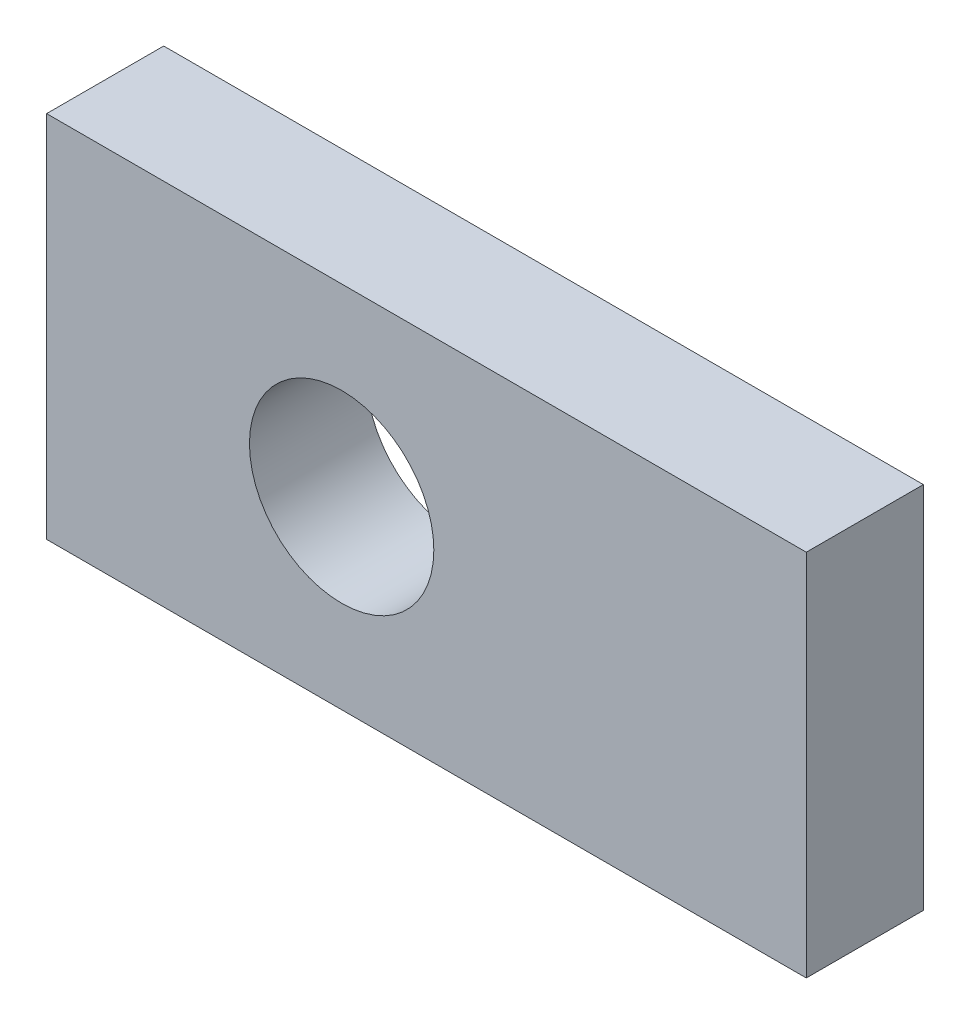
ISO-10303-21;
HEADER;
FILE_DESCRIPTION(('STEP AP214'),'2;1');
FILE_NAME('part.step','',(''),(''),'','','');
FILE_SCHEMA(('AUTOMOTIVE_DESIGN { 1 0 10303 214 1 1 1 1 }'));
ENDSEC;
DATA;
#1=APPLICATION_CONTEXT('core data for automotive mechanical design processes');
#2=APPLICATION_PROTOCOL_DEFINITION('international standard','automotive_design',2000,#1);
#3=PRODUCT_CONTEXT('',#1,'mechanical');
#4=PRODUCT('Part','Part','',(#3));
#5=PRODUCT_RELATED_PRODUCT_CATEGORY('part','',(#4));
#6=PRODUCT_DEFINITION_FORMATION('','',#4);
#7=PRODUCT_DEFINITION_CONTEXT('part definition',#1,'design');
#8=PRODUCT_DEFINITION('design','',#6,#7);
#9=PRODUCT_DEFINITION_SHAPE('','',#8);
#10=(LENGTH_UNIT() NAMED_UNIT(*) SI_UNIT(.MILLI.,.METRE.));
#11=(NAMED_UNIT(*) PLANE_ANGLE_UNIT() SI_UNIT($,.RADIAN.));
#12=(NAMED_UNIT(*) SI_UNIT($,.STERADIAN.) SOLID_ANGLE_UNIT());
#13=UNCERTAINTY_MEASURE_WITH_UNIT(LENGTH_MEASURE(1.E-05),#10,'distance_accuracy_value','');
#14=(GEOMETRIC_REPRESENTATION_CONTEXT(3) GLOBAL_UNCERTAINTY_ASSIGNED_CONTEXT((#13)) GLOBAL_UNIT_ASSIGNED_CONTEXT((#10,
#11,#12)) REPRESENTATION_CONTEXT('',''));
#15=CARTESIAN_POINT('',(0.,0.,0.));
#16=DIRECTION('',(0.,0.,1.));
#17=DIRECTION('',(1.,0.,0.));
#18=AXIS2_PLACEMENT_3D('',#15,#16,#17);
#19=CARTESIAN_POINT('',(-10.3,10.,1.5875));
#20=DIRECTION('',(1.,0.,0.));
#21=DIRECTION('',(0.,0.,-1.));
#22=AXIS2_PLACEMENT_3D('',#19,#20,#21);
#23=PLANE('',#22);
#24=DIRECTION('',(0.,0.,1.));
#25=VECTOR('',#24,1.);
#26=CARTESIAN_POINT('',(-10.3,0.,1.5875));
#27=LINE('',#26,#25);
#28=CARTESIAN_POINT('',(-10.3,0.,-1.5875));
#29=VERTEX_POINT('',#28);
#30=CARTESIAN_POINT('',(-10.3,0.,1.5875));
#31=VERTEX_POINT('',#30);
#32=EDGE_CURVE('E107',#29,#31,#27,.T.);
#33=ORIENTED_EDGE('',*,*,#32,.T.);
#34=DIRECTION('',(0.,-1.,0.));
#35=VECTOR('',#34,1.);
#36=CARTESIAN_POINT('',(-10.3,10.,1.5875));
#37=LINE('',#36,#35);
#38=CARTESIAN_POINT('',(-10.3,10.,1.5875));
#39=VERTEX_POINT('',#38);
#40=EDGE_CURVE('E11',#39,#31,#37,.T.);
#41=ORIENTED_EDGE('',*,*,#40,.F.);
#42=DIRECTION('',(0.,0.,1.));
#43=VECTOR('',#42,1.);
#44=CARTESIAN_POINT('',(-10.3,10.,1.5875));
#45=LINE('',#44,#43);
#46=CARTESIAN_POINT('',(-10.3,10.,-1.5875));
#47=VERTEX_POINT('',#46);
#48=EDGE_CURVE('E91',#47,#39,#45,.T.);
#49=ORIENTED_EDGE('',*,*,#48,.F.);
#50=DIRECTION('',(0.,-1.,0.));
#51=VECTOR('',#50,1.);
#52=CARTESIAN_POINT('',(-10.3,10.,-1.5875));
#53=LINE('',#52,#51);
#54=EDGE_CURVE('E103',#47,#29,#53,.T.);
#55=ORIENTED_EDGE('',*,*,#54,.T.);
#56=EDGE_LOOP('',(#33,#41,#49,#55));
#57=FACE_BOUND('',#56,.T.);
#58=ADVANCED_FACE('F39',(#57),#23,.F.);
#59=CARTESIAN_POINT('',(10.3,10.,1.5875));
#60=DIRECTION('',(0.,0.,-1.));
#61=DIRECTION('',(-1.,0.,0.));
#62=AXIS2_PLACEMENT_3D('',#59,#60,#61);
#63=PLANE('',#62);
#64=CARTESIAN_POINT('',(-2.29999999999999,5.,1.5875));
#65=DIRECTION('',(0.,0.,1.));
#66=DIRECTION('',(1.,0.,0.));
#67=AXIS2_PLACEMENT_3D('',#64,#65,#66);
#68=CIRCLE('',#67,2.5);
#69=CARTESIAN_POINT('',(0.200000000000012,5.,1.5875));
#70=VERTEX_POINT('',#69);
#71=EDGE_CURVE('E128',#70,#70,#68,.T.);
#72=ORIENTED_EDGE('',*,*,#71,.F.);
#73=EDGE_LOOP('',(#72));
#74=FACE_BOUND('',#73,.T.);
#75=DIRECTION('',(1.,0.,0.));
#76=VECTOR('',#75,1.);
#77=CARTESIAN_POINT('',(10.3,0.,1.5875));
#78=LINE('',#77,#76);
#79=CARTESIAN_POINT('',(10.3,0.,1.5875));
#80=VERTEX_POINT('',#79);
#81=EDGE_CURVE('E96',#31,#80,#78,.T.);
#82=ORIENTED_EDGE('',*,*,#81,.T.);
#83=DIRECTION('',(0.,-1.,0.));
#84=VECTOR('',#83,1.);
#85=CARTESIAN_POINT('',(10.3,10.,1.5875));
#86=LINE('',#85,#84);
#87=CARTESIAN_POINT('',(10.3,10.,1.5875));
#88=VERTEX_POINT('',#87);
#89=EDGE_CURVE('E48',#88,#80,#86,.T.);
#90=ORIENTED_EDGE('',*,*,#89,.F.);
#91=DIRECTION('',(1.,0.,0.));
#92=VECTOR('',#91,1.);
#93=CARTESIAN_POINT('',(10.3,10.,1.5875));
#94=LINE('',#93,#92);
#95=EDGE_CURVE('E86',#39,#88,#94,.T.);
#96=ORIENTED_EDGE('',*,*,#95,.F.);
#97=ORIENTED_EDGE('',*,*,#40,.T.);
#98=EDGE_LOOP('',(#82,#90,#96,#97));
#99=FACE_BOUND('',#98,.T.);
#100=ADVANCED_FACE('F95',(#74,#99),#63,.F.);
#101=CARTESIAN_POINT('',(10.3,10.,1.5875));
#102=DIRECTION('',(-1.,0.,0.));
#103=DIRECTION('',(0.,0.,1.));
#104=AXIS2_PLACEMENT_3D('',#101,#102,#103);
#105=PLANE('',#104);
#106=DIRECTION('',(0.,0.,-1.));
#107=VECTOR('',#106,1.);
#108=CARTESIAN_POINT('',(10.3,0.,1.5875));
#109=LINE('',#108,#107);
#110=CARTESIAN_POINT('',(10.3,0.,-1.5875));
#111=VERTEX_POINT('',#110);
#112=EDGE_CURVE('E73',#80,#111,#109,.T.);
#113=ORIENTED_EDGE('',*,*,#112,.T.);
#114=DIRECTION('',(0.,-1.,0.));
#115=VECTOR('',#114,1.);
#116=CARTESIAN_POINT('',(10.3,10.,-1.5875));
#117=LINE('',#116,#115);
#118=CARTESIAN_POINT('',(10.3,10.,-1.5875));
#119=VERTEX_POINT('',#118);
#120=EDGE_CURVE('E98',#119,#111,#117,.T.);
#121=ORIENTED_EDGE('',*,*,#120,.F.);
#122=DIRECTION('',(0.,0.,-1.));
#123=VECTOR('',#122,1.);
#124=CARTESIAN_POINT('',(10.3,10.,1.5875));
#125=LINE('',#124,#123);
#126=EDGE_CURVE('E89',#88,#119,#125,.T.);
#127=ORIENTED_EDGE('',*,*,#126,.F.);
#128=ORIENTED_EDGE('',*,*,#89,.T.);
#129=EDGE_LOOP('',(#113,#121,#127,#128));
#130=FACE_BOUND('',#129,.T.);
#131=ADVANCED_FACE('F99',(#130),#105,.F.);
#132=CARTESIAN_POINT('',(10.3,10.,-1.5875));
#133=DIRECTION('',(0.,0.,1.));
#134=DIRECTION('',(1.,0.,0.));
#135=AXIS2_PLACEMENT_3D('',#132,#133,#134);
#136=PLANE('',#135);
#137=CARTESIAN_POINT('',(-2.29999999999999,5.,-1.5875));
#138=DIRECTION('',(0.,0.,1.));
#139=DIRECTION('',(1.,0.,0.));
#140=AXIS2_PLACEMENT_3D('',#137,#138,#139);
#141=CIRCLE('',#140,2.5);
#142=CARTESIAN_POINT('',(0.200000000000012,5.,-1.5875));
#143=VERTEX_POINT('',#142);
#144=EDGE_CURVE('E111',#143,#143,#141,.T.);
#145=ORIENTED_EDGE('',*,*,#144,.T.);
#146=EDGE_LOOP('',(#145));
#147=FACE_BOUND('',#146,.T.);
#148=DIRECTION('',(-1.,0.,0.));
#149=VECTOR('',#148,1.);
#150=CARTESIAN_POINT('',(10.3,0.,-1.5875));
#151=LINE('',#150,#149);
#152=EDGE_CURVE('E79',#111,#29,#151,.T.);
#153=ORIENTED_EDGE('',*,*,#152,.T.);
#154=ORIENTED_EDGE('',*,*,#54,.F.);
#155=DIRECTION('',(-1.,0.,0.));
#156=VECTOR('',#155,1.);
#157=CARTESIAN_POINT('',(10.3,10.,-1.5875));
#158=LINE('',#157,#156);
#159=EDGE_CURVE('E56',#119,#47,#158,.T.);
#160=ORIENTED_EDGE('',*,*,#159,.F.);
#161=ORIENTED_EDGE('',*,*,#120,.T.);
#162=EDGE_LOOP('',(#153,#154,#160,#161));
#163=FACE_BOUND('',#162,.T.);
#164=ADVANCED_FACE('F121',(#147,#163),#136,.F.);
#165=CARTESIAN_POINT('',(0.,10.,0.));
#166=DIRECTION('',(0.,1.,0.));
#167=DIRECTION('',(0.,0.,1.));
#168=AXIS2_PLACEMENT_3D('',#165,#166,#167);
#169=PLANE('',#168);
#170=ORIENTED_EDGE('',*,*,#48,.T.);
#171=ORIENTED_EDGE('',*,*,#95,.T.);
#172=ORIENTED_EDGE('',*,*,#126,.T.);
#173=ORIENTED_EDGE('',*,*,#159,.T.);
#174=EDGE_LOOP('',(#170,#171,#172,#173));
#175=FACE_BOUND('',#174,.T.);
#176=ADVANCED_FACE('F87',(#175),#169,.T.);
#177=CARTESIAN_POINT('',(0.,0.,0.));
#178=DIRECTION('',(0.,1.,0.));
#179=DIRECTION('',(0.,0.,1.));
#180=AXIS2_PLACEMENT_3D('',#177,#178,#179);
#181=PLANE('',#180);
#182=ORIENTED_EDGE('',*,*,#32,.F.);
#183=ORIENTED_EDGE('',*,*,#152,.F.);
#184=ORIENTED_EDGE('',*,*,#112,.F.);
#185=ORIENTED_EDGE('',*,*,#81,.F.);
#186=EDGE_LOOP('',(#182,#183,#184,#185));
#187=FACE_BOUND('',#186,.T.);
#188=ADVANCED_FACE('F124',(#187),#181,.F.);
#189=CARTESIAN_POINT('',(-2.29999999999999,5.,-1.5875));
#190=DIRECTION('',(0.,0.,1.));
#191=DIRECTION('',(1.,0.,0.));
#192=AXIS2_PLACEMENT_3D('',#189,#190,#191);
#193=CYLINDRICAL_SURFACE('',#192,2.5);
#194=ORIENTED_EDGE('',*,*,#144,.F.);
#195=EDGE_LOOP('',(#194));
#196=FACE_BOUND('',#195,.T.);
#197=ORIENTED_EDGE('',*,*,#71,.T.);
#198=EDGE_LOOP('',(#197));
#199=FACE_BOUND('',#198,.T.);
#200=ADVANCED_FACE('F137',(#196,#199),#193,.F.);
#201=CLOSED_SHELL('',(#58,#100,#131,#164,#176,#188,#200));
#202=MANIFOLD_SOLID_BREP('B2',#201);
#203=ADVANCED_BREP_SHAPE_REPRESENTATION('',(#18,#202),#14);
#204=SHAPE_DEFINITION_REPRESENTATION(#9,#203);
ENDSEC;
END-ISO-10303-21;
